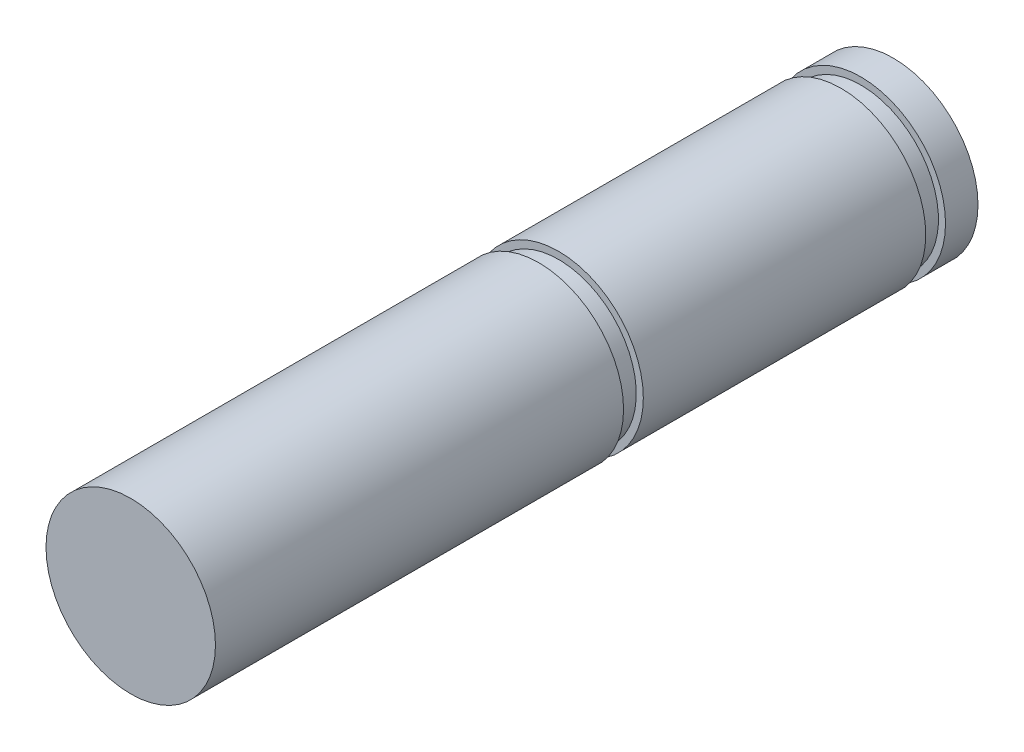
ISO-10303-21;
HEADER;
FILE_DESCRIPTION(('STEP AP214'),'2;1');
FILE_NAME('part.step','',(''),(''),'','','');
FILE_SCHEMA(('AUTOMOTIVE_DESIGN { 1 0 10303 214 1 1 1 1 }'));
ENDSEC;
DATA;
#1=APPLICATION_CONTEXT('core data for automotive mechanical design processes');
#2=APPLICATION_PROTOCOL_DEFINITION('international standard','automotive_design',2000,#1);
#3=PRODUCT_CONTEXT('',#1,'mechanical');
#4=PRODUCT('Part','Part','',(#3));
#5=PRODUCT_RELATED_PRODUCT_CATEGORY('part','',(#4));
#6=PRODUCT_DEFINITION_FORMATION('','',#4);
#7=PRODUCT_DEFINITION_CONTEXT('part definition',#1,'design');
#8=PRODUCT_DEFINITION('design','',#6,#7);
#9=PRODUCT_DEFINITION_SHAPE('','',#8);
#10=(LENGTH_UNIT() NAMED_UNIT(*) SI_UNIT(.MILLI.,.METRE.));
#11=(NAMED_UNIT(*) PLANE_ANGLE_UNIT() SI_UNIT($,.RADIAN.));
#12=(NAMED_UNIT(*) SI_UNIT($,.STERADIAN.) SOLID_ANGLE_UNIT());
#13=UNCERTAINTY_MEASURE_WITH_UNIT(LENGTH_MEASURE(1.E-05),#10,'distance_accuracy_value','');
#14=(GEOMETRIC_REPRESENTATION_CONTEXT(3) GLOBAL_UNCERTAINTY_ASSIGNED_CONTEXT((#13)) GLOBAL_UNIT_ASSIGNED_CONTEXT((#10,
#11,#12)) REPRESENTATION_CONTEXT('',''));
#15=CARTESIAN_POINT('',(0.,0.,0.));
#16=DIRECTION('',(0.,0.,1.));
#17=DIRECTION('',(1.,0.,0.));
#18=AXIS2_PLACEMENT_3D('',#15,#16,#17);
#19=CARTESIAN_POINT('',(0.,0.,27.));
#20=DIRECTION('',(0.,0.,-1.));
#21=DIRECTION('',(-1.,0.,0.));
#22=AXIS2_PLACEMENT_3D('',#19,#20,#21);
#23=CYLINDRICAL_SURFACE('',#22,3.);
#24=CARTESIAN_POINT('',(0.,0.,1.15));
#25=DIRECTION('',(0.,0.,-1.));
#26=DIRECTION('',(-1.,0.,0.));
#27=AXIS2_PLACEMENT_3D('',#24,#25,#26);
#28=CIRCLE('',#27,3.);
#29=CARTESIAN_POINT('',(-3.,0.,1.15));
#30=VERTEX_POINT('',#29);
#31=EDGE_CURVE('E48',#30,#30,#28,.T.);
#32=ORIENTED_EDGE('',*,*,#31,.T.);
#33=EDGE_LOOP('',(#32));
#34=FACE_BOUND('',#33,.T.);
#35=CARTESIAN_POINT('',(0.,0.,0.));
#36=DIRECTION('',(0.,0.,1.));
#37=DIRECTION('',(1.,0.,0.));
#38=AXIS2_PLACEMENT_3D('',#35,#36,#37);
#39=CIRCLE('',#38,3.);
#40=CARTESIAN_POINT('',(3.,0.,0.));
#41=VERTEX_POINT('',#40);
#42=EDGE_CURVE('E39',#41,#41,#39,.T.);
#43=ORIENTED_EDGE('',*,*,#42,.T.);
#44=EDGE_LOOP('',(#43));
#45=FACE_BOUND('',#44,.T.);
#46=ADVANCED_FACE('F36',(#34,#45),#23,.T.);
#47=CARTESIAN_POINT('',(0.,0.,0.));
#48=DIRECTION('',(0.,0.,1.));
#49=DIRECTION('',(1.,0.,0.));
#50=AXIS2_PLACEMENT_3D('',#47,#48,#49);
#51=PLANE('',#50);
#52=ORIENTED_EDGE('',*,*,#42,.F.);
#53=EDGE_LOOP('',(#52));
#54=FACE_BOUND('',#53,.T.);
#55=ADVANCED_FACE('F106',(#54),#51,.F.);
#56=CARTESIAN_POINT('',(0.,0.,1.15));
#57=DIRECTION('',(0.,0.,-1.));
#58=DIRECTION('',(-1.,0.,0.));
#59=AXIS2_PLACEMENT_3D('',#56,#57,#58);
#60=PLANE('',#59);
#61=ORIENTED_EDGE('',*,*,#31,.F.);
#62=EDGE_LOOP('',(#61));
#63=FACE_BOUND('',#62,.T.);
#64=CARTESIAN_POINT('',(0.,0.,1.15));
#65=DIRECTION('',(0.,0.,-1.));
#66=DIRECTION('',(-1.,0.,0.));
#67=AXIS2_PLACEMENT_3D('',#64,#65,#66);
#68=CIRCLE('',#67,2.75);
#69=CARTESIAN_POINT('',(-2.75,0.,1.15));
#70=VERTEX_POINT('',#69);
#71=EDGE_CURVE('E53',#70,#70,#68,.T.);
#72=ORIENTED_EDGE('',*,*,#71,.T.);
#73=EDGE_LOOP('',(#72));
#74=FACE_BOUND('',#73,.T.);
#75=ADVANCED_FACE('F113',(#63,#74),#60,.F.);
#76=CARTESIAN_POINT('',(0.,0.,1.15));
#77=DIRECTION('',(0.,0.,1.));
#78=DIRECTION('',(1.,0.,0.));
#79=AXIS2_PLACEMENT_3D('',#76,#77,#78);
#80=CYLINDRICAL_SURFACE('',#79,2.75);
#81=ORIENTED_EDGE('',*,*,#71,.F.);
#82=EDGE_LOOP('',(#81));
#83=FACE_BOUND('',#82,.T.);
#84=CARTESIAN_POINT('',(0.,0.,1.85));
#85=DIRECTION('',(0.,0.,-1.));
#86=DIRECTION('',(-1.,0.,0.));
#87=AXIS2_PLACEMENT_3D('',#84,#85,#86);
#88=CIRCLE('',#87,2.75);
#89=CARTESIAN_POINT('',(-2.75,0.,1.85));
#90=VERTEX_POINT('',#89);
#91=EDGE_CURVE('E61',#90,#90,#88,.T.);
#92=ORIENTED_EDGE('',*,*,#91,.T.);
#93=EDGE_LOOP('',(#92));
#94=FACE_BOUND('',#93,.T.);
#95=ADVANCED_FACE('F121',(#83,#94),#80,.T.);
#96=CARTESIAN_POINT('',(0.,0.,1.85));
#97=DIRECTION('',(0.,0.,-1.));
#98=DIRECTION('',(-1.,0.,0.));
#99=AXIS2_PLACEMENT_3D('',#96,#97,#98);
#100=PLANE('',#99);
#101=ORIENTED_EDGE('',*,*,#91,.F.);
#102=EDGE_LOOP('',(#101));
#103=FACE_BOUND('',#102,.T.);
#104=CARTESIAN_POINT('',(0.,0.,1.85));
#105=DIRECTION('',(0.,0.,-1.));
#106=DIRECTION('',(-1.,0.,0.));
#107=AXIS2_PLACEMENT_3D('',#104,#105,#106);
#108=CIRCLE('',#107,3.);
#109=CARTESIAN_POINT('',(-3.,0.,1.85));
#110=VERTEX_POINT('',#109);
#111=EDGE_CURVE('E57',#110,#110,#108,.T.);
#112=ORIENTED_EDGE('',*,*,#111,.T.);
#113=EDGE_LOOP('',(#112));
#114=FACE_BOUND('',#113,.T.);
#115=ADVANCED_FACE('F103',(#103,#114),#100,.T.);
#116=CARTESIAN_POINT('',(0.,0.,11.85));
#117=DIRECTION('',(0.,0.,-1.));
#118=DIRECTION('',(-1.,0.,0.));
#119=AXIS2_PLACEMENT_3D('',#116,#117,#118);
#120=CIRCLE('',#119,3.);
#121=CARTESIAN_POINT('',(-3.,0.,11.85));
#122=VERTEX_POINT('',#121);
#123=EDGE_CURVE('E66',#122,#122,#120,.T.);
#124=ORIENTED_EDGE('',*,*,#123,.T.);
#125=EDGE_LOOP('',(#124));
#126=FACE_BOUND('',#125,.T.);
#127=ORIENTED_EDGE('',*,*,#111,.F.);
#128=EDGE_LOOP('',(#127));
#129=FACE_BOUND('',#128,.T.);
#130=ADVANCED_FACE('F89',(#126,#129),#23,.T.);
#131=CARTESIAN_POINT('',(0.,0.,12.55));
#132=DIRECTION('',(0.,0.,-1.));
#133=DIRECTION('',(-1.,0.,0.));
#134=AXIS2_PLACEMENT_3D('',#131,#132,#133);
#135=PLANE('',#134);
#136=CARTESIAN_POINT('',(0.,0.,12.55));
#137=DIRECTION('',(0.,0.,-1.));
#138=DIRECTION('',(-1.,0.,0.));
#139=AXIS2_PLACEMENT_3D('',#136,#137,#138);
#140=CIRCLE('',#139,2.75);
#141=CARTESIAN_POINT('',(-2.75,0.,12.55));
#142=VERTEX_POINT('',#141);
#143=EDGE_CURVE('E70',#142,#142,#140,.T.);
#144=ORIENTED_EDGE('',*,*,#143,.F.);
#145=EDGE_LOOP('',(#144));
#146=FACE_BOUND('',#145,.T.);
#147=CARTESIAN_POINT('',(0.,0.,12.55));
#148=DIRECTION('',(0.,0.,-1.));
#149=DIRECTION('',(-1.,0.,0.));
#150=AXIS2_PLACEMENT_3D('',#147,#148,#149);
#151=CIRCLE('',#150,3.);
#152=CARTESIAN_POINT('',(-3.,0.,12.55));
#153=VERTEX_POINT('',#152);
#154=EDGE_CURVE('E65',#153,#153,#151,.T.);
#155=ORIENTED_EDGE('',*,*,#154,.T.);
#156=EDGE_LOOP('',(#155));
#157=FACE_BOUND('',#156,.T.);
#158=ADVANCED_FACE('F85',(#146,#157),#135,.T.);
#159=CARTESIAN_POINT('',(0.,0.,11.85));
#160=DIRECTION('',(0.,0.,-1.));
#161=DIRECTION('',(-1.,0.,0.));
#162=AXIS2_PLACEMENT_3D('',#159,#160,#161);
#163=PLANE('',#162);
#164=CARTESIAN_POINT('',(0.,0.,11.85));
#165=DIRECTION('',(0.,0.,-1.));
#166=DIRECTION('',(-1.,0.,0.));
#167=AXIS2_PLACEMENT_3D('',#164,#165,#166);
#168=CIRCLE('',#167,2.75);
#169=CARTESIAN_POINT('',(-2.75,0.,11.85));
#170=VERTEX_POINT('',#169);
#171=EDGE_CURVE('E74',#170,#170,#168,.T.);
#172=ORIENTED_EDGE('',*,*,#171,.T.);
#173=EDGE_LOOP('',(#172));
#174=FACE_BOUND('',#173,.T.);
#175=ORIENTED_EDGE('',*,*,#123,.F.);
#176=EDGE_LOOP('',(#175));
#177=FACE_BOUND('',#176,.T.);
#178=ADVANCED_FACE('F88',(#174,#177),#163,.F.);
#179=CARTESIAN_POINT('',(0.,0.,12.55));
#180=DIRECTION('',(0.,0.,-1.));
#181=DIRECTION('',(-1.,0.,0.));
#182=AXIS2_PLACEMENT_3D('',#179,#180,#181);
#183=CYLINDRICAL_SURFACE('',#182,2.75);
#184=ORIENTED_EDGE('',*,*,#143,.T.);
#185=EDGE_LOOP('',(#184));
#186=FACE_BOUND('',#185,.T.);
#187=ORIENTED_EDGE('',*,*,#171,.F.);
#188=EDGE_LOOP('',(#187));
#189=FACE_BOUND('',#188,.T.);
#190=ADVANCED_FACE('F82',(#186,#189),#183,.T.);
#191=CARTESIAN_POINT('',(0.,0.,27.));
#192=DIRECTION('',(0.,0.,1.));
#193=DIRECTION('',(1.,0.,0.));
#194=AXIS2_PLACEMENT_3D('',#191,#192,#193);
#195=PLANE('',#194);
#196=CARTESIAN_POINT('',(0.,0.,27.));
#197=DIRECTION('',(0.,0.,1.));
#198=DIRECTION('',(1.,0.,0.));
#199=AXIS2_PLACEMENT_3D('',#196,#197,#198);
#200=CIRCLE('',#199,3.);
#201=CARTESIAN_POINT('',(3.,0.,27.));
#202=VERTEX_POINT('',#201);
#203=EDGE_CURVE('E10',#202,#202,#200,.T.);
#204=ORIENTED_EDGE('',*,*,#203,.T.);
#205=EDGE_LOOP('',(#204));
#206=FACE_BOUND('',#205,.T.);
#207=ADVANCED_FACE('F95',(#206),#195,.T.);
#208=ORIENTED_EDGE('',*,*,#203,.F.);
#209=EDGE_LOOP('',(#208));
#210=FACE_BOUND('',#209,.T.);
#211=ORIENTED_EDGE('',*,*,#154,.F.);
#212=EDGE_LOOP('',(#211));
#213=FACE_BOUND('',#212,.T.);
#214=ADVANCED_FACE('F93',(#210,#213),#23,.T.);
#215=CLOSED_SHELL('',(#46,#55,#75,#95,#115,#130,#158,#178,#190,#207,#214));
#216=MANIFOLD_SOLID_BREP('B2',#215);
#217=ADVANCED_BREP_SHAPE_REPRESENTATION('',(#18,#216),#14);
#218=SHAPE_DEFINITION_REPRESENTATION(#9,#217);
ENDSEC;
END-ISO-10303-21;
